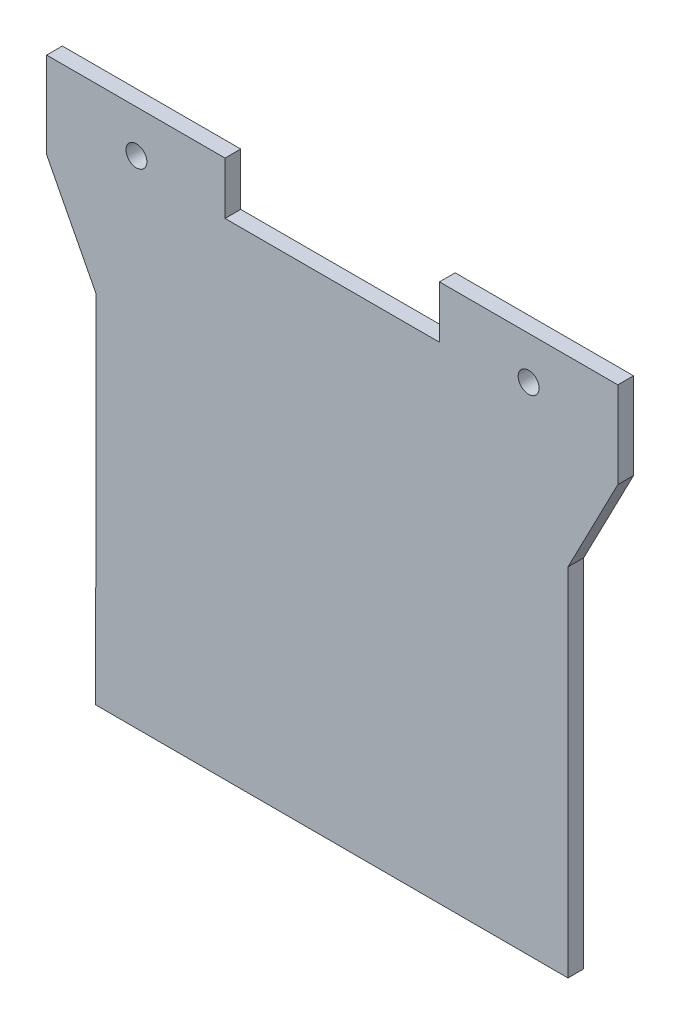
ISO-10303-21;
HEADER;
FILE_DESCRIPTION(('STEP AP214'),'2;1');
FILE_NAME('part.step','',(''),(''),'','','');
FILE_SCHEMA(('AUTOMOTIVE_DESIGN { 1 0 10303 214 1 1 1 1 }'));
ENDSEC;
DATA;
#1=APPLICATION_CONTEXT('core data for automotive mechanical design processes');
#2=APPLICATION_PROTOCOL_DEFINITION('international standard','automotive_design',2000,#1);
#3=PRODUCT_CONTEXT('',#1,'mechanical');
#4=PRODUCT('Part','Part','',(#3));
#5=PRODUCT_RELATED_PRODUCT_CATEGORY('part','',(#4));
#6=PRODUCT_DEFINITION_FORMATION('','',#4);
#7=PRODUCT_DEFINITION_CONTEXT('part definition',#1,'design');
#8=PRODUCT_DEFINITION('design','',#6,#7);
#9=PRODUCT_DEFINITION_SHAPE('','',#8);
#10=(LENGTH_UNIT() NAMED_UNIT(*) SI_UNIT(.MILLI.,.METRE.));
#11=(NAMED_UNIT(*) PLANE_ANGLE_UNIT() SI_UNIT($,.RADIAN.));
#12=(NAMED_UNIT(*) SI_UNIT($,.STERADIAN.) SOLID_ANGLE_UNIT());
#13=UNCERTAINTY_MEASURE_WITH_UNIT(LENGTH_MEASURE(1.E-05),#10,'distance_accuracy_value','');
#14=(GEOMETRIC_REPRESENTATION_CONTEXT(3) GLOBAL_UNCERTAINTY_ASSIGNED_CONTEXT((#13)) GLOBAL_UNIT_ASSIGNED_CONTEXT((#10,
#11,#12)) REPRESENTATION_CONTEXT('',''));
#15=CARTESIAN_POINT('',(0.,0.,0.));
#16=DIRECTION('',(0.,0.,1.));
#17=DIRECTION('',(1.,0.,0.));
#18=AXIS2_PLACEMENT_3D('',#15,#16,#17);
#19=CARTESIAN_POINT('',(0.,0.,3.));
#20=DIRECTION('',(0.,0.,1.));
#21=DIRECTION('',(1.,0.,0.));
#22=AXIS2_PLACEMENT_3D('',#19,#20,#21);
#23=PLANE('',#22);
#24=CARTESIAN_POINT('',(0.,0.,3.));
#25=DIRECTION('',(0.,0.,1.));
#26=DIRECTION('',(1.,0.,0.));
#27=AXIS2_PLACEMENT_3D('',#24,#25,#26);
#28=CIRCLE('',#27,2.);
#29=CARTESIAN_POINT('',(2.,0.,3.));
#30=VERTEX_POINT('',#29);
#31=EDGE_CURVE('E166',#30,#30,#28,.T.);
#32=ORIENTED_EDGE('',*,*,#31,.F.);
#33=EDGE_LOOP('',(#32));
#34=FACE_BOUND('',#33,.T.);
#35=DIRECTION('',(0.460081544608264,0.887876665033424,0.));
#36=VECTOR('',#35,1.);
#37=CARTESIAN_POINT('',(92.0524081163952,-8.43619126412211,3.));
#38=LINE('',#37,#36);
#39=CARTESIAN_POINT('',(82.5303663530536,-26.8120613337274,3.));
#40=VERTEX_POINT('',#39);
#41=CARTESIAN_POINT('',(92.0524081163952,-8.43619126412211,3.));
#42=VERTEX_POINT('',#41);
#43=EDGE_CURVE('E185',#40,#42,#38,.T.);
#44=ORIENTED_EDGE('',*,*,#43,.T.);
#45=DIRECTION('',(0.,1.,0.));
#46=VECTOR('',#45,1.);
#47=CARTESIAN_POINT('',(92.0524081163952,8.10208816705338,3.));
#48=LINE('',#47,#46);
#49=CARTESIAN_POINT('',(92.0524081163952,8.10208816705338,3.));
#50=VERTEX_POINT('',#49);
#51=EDGE_CURVE('E113',#42,#50,#48,.T.);
#52=ORIENTED_EDGE('',*,*,#51,.T.);
#53=DIRECTION('',(-1.,0.,0.));
#54=VECTOR('',#53,1.);
#55=CARTESIAN_POINT('',(57.9475918836048,8.10208816705338,3.));
#56=LINE('',#55,#54);
#57=CARTESIAN_POINT('',(57.9475918836048,8.10208816705338,3.));
#58=VERTEX_POINT('',#57);
#59=EDGE_CURVE('E212',#50,#58,#56,.T.);
#60=ORIENTED_EDGE('',*,*,#59,.T.);
#61=DIRECTION('',(0.,-1.,0.));
#62=VECTOR('',#61,1.);
#63=CARTESIAN_POINT('',(57.9475918836048,-1.89791183294662,3.));
#64=LINE('',#63,#62);
#65=CARTESIAN_POINT('',(57.9475918836048,-1.89791183294662,3.));
#66=VERTEX_POINT('',#65);
#67=EDGE_CURVE('E231',#58,#66,#64,.T.);
#68=ORIENTED_EDGE('',*,*,#67,.T.);
#69=DIRECTION('',(-1.,0.,0.));
#70=VECTOR('',#69,1.);
#71=CARTESIAN_POINT('',(16.9429738260778,-1.89791183294662,3.));
#72=LINE('',#71,#70);
#73=CARTESIAN_POINT('',(16.9429738260778,-1.89791183294662,3.));
#74=VERTEX_POINT('',#73);
#75=EDGE_CURVE('E228',#66,#74,#72,.T.);
#76=ORIENTED_EDGE('',*,*,#75,.T.);
#77=DIRECTION('',(0.,1.,0.));
#78=VECTOR('',#77,1.);
#79=CARTESIAN_POINT('',(16.9429738260778,-1.89791183294662,3.));
#80=LINE('',#79,#78);
#81=CARTESIAN_POINT('',(16.9429738260778,8.10208816705338,3.));
#82=VERTEX_POINT('',#81);
#83=EDGE_CURVE('E230',#74,#82,#80,.T.);
#84=ORIENTED_EDGE('',*,*,#83,.T.);
#85=DIRECTION('',(-1.,0.,0.));
#86=VECTOR('',#85,1.);
#87=CARTESIAN_POINT('',(-17.1710785217665,8.10208816705338,3.));
#88=LINE('',#87,#86);
#89=CARTESIAN_POINT('',(-17.1710785217665,8.10208816705338,3.));
#90=VERTEX_POINT('',#89);
#91=EDGE_CURVE('E233',#82,#90,#88,.T.);
#92=ORIENTED_EDGE('',*,*,#91,.T.);
#93=DIRECTION('',(-0.00157683113051485,-0.99999875680102,0.));
#94=VECTOR('',#93,1.);
#95=CARTESIAN_POINT('',(-17.197021162703,-8.35028151452313,3.));
#96=LINE('',#95,#94);
#97=CARTESIAN_POINT('',(-17.197021162703,-8.35028151452313,3.));
#98=VERTEX_POINT('',#97);
#99=EDGE_CURVE('E239',#90,#98,#96,.T.);
#100=ORIENTED_EDGE('',*,*,#99,.T.);
#101=DIRECTION('',(0.458684589096778,-0.88859914906842,0.));
#102=VECTOR('',#101,1.);
#103=CARTESIAN_POINT('',(-17.197021162703,-8.35028151452313,3.));
#104=LINE('',#103,#102);
#105=CARTESIAN_POINT('',(-7.7038913800261,-26.7411044185448,3.));
#106=VERTEX_POINT('',#105);
#107=EDGE_CURVE('E144',#98,#106,#104,.T.);
#108=ORIENTED_EDGE('',*,*,#107,.T.);
#109=DIRECTION('',(-0.00157272577151431,-0.999998763266059,0.));
#110=VECTOR('',#109,1.);
#111=CARTESIAN_POINT('',(-7.81096902870989,-94.8251392812351,3.));
#112=LINE('',#111,#110);
#113=CARTESIAN_POINT('',(-7.81096902870989,-94.8251392812351,3.));
#114=VERTEX_POINT('',#113);
#115=EDGE_CURVE('E138',#106,#114,#112,.T.);
#116=ORIENTED_EDGE('',*,*,#115,.T.);
#117=DIRECTION('',(0.999999690816467,-0.000786363128887586,0.));
#118=VECTOR('',#117,1.);
#119=CARTESIAN_POINT('',(-7.81096902870989,-94.8251392812351,3.));
#120=LINE('',#119,#118);
#121=CARTESIAN_POINT('',(82.5303663530536,-94.8961803983585,3.));
#122=VERTEX_POINT('',#121);
#123=EDGE_CURVE('E142',#114,#122,#120,.T.);
#124=ORIENTED_EDGE('',*,*,#123,.T.);
#125=DIRECTION('',(0.,1.,0.));
#126=VECTOR('',#125,1.);
#127=CARTESIAN_POINT('',(82.5303663530536,-26.8120613337274,3.));
#128=LINE('',#127,#126);
#129=EDGE_CURVE('E58',#122,#40,#128,.T.);
#130=ORIENTED_EDGE('',*,*,#129,.T.);
#131=EDGE_LOOP('',(#44,#52,#60,#68,#76,#84,#92,#100,#108,#116,#124,#130));
#132=FACE_BOUND('',#131,.T.);
#133=CARTESIAN_POINT('',(75.,0.,3.));
#134=DIRECTION('',(0.,0.,1.));
#135=DIRECTION('',(1.,0.,0.));
#136=AXIS2_PLACEMENT_3D('',#133,#134,#135);
#137=CIRCLE('',#136,2.);
#138=CARTESIAN_POINT('',(77.,0.,3.));
#139=VERTEX_POINT('',#138);
#140=EDGE_CURVE('E281',#139,#139,#137,.T.);
#141=ORIENTED_EDGE('',*,*,#140,.F.);
#142=EDGE_LOOP('',(#141));
#143=FACE_BOUND('',#142,.T.);
#144=ADVANCED_FACE('F41',(#34,#132,#143),#23,.T.);
#145=CARTESIAN_POINT('',(0.,0.,0.));
#146=DIRECTION('',(0.,0.,1.));
#147=DIRECTION('',(1.,0.,0.));
#148=AXIS2_PLACEMENT_3D('',#145,#146,#147);
#149=PLANE('',#148);
#150=DIRECTION('',(0.460081544608264,0.887876665033424,0.));
#151=VECTOR('',#150,1.);
#152=CARTESIAN_POINT('',(92.0524081163952,-8.43619126412211,0.));
#153=LINE('',#152,#151);
#154=CARTESIAN_POINT('',(82.5303663530536,-26.8120613337274,0.));
#155=VERTEX_POINT('',#154);
#156=CARTESIAN_POINT('',(92.0524081163952,-8.43619126412211,0.));
#157=VERTEX_POINT('',#156);
#158=EDGE_CURVE('E162',#155,#157,#153,.T.);
#159=ORIENTED_EDGE('',*,*,#158,.F.);
#160=DIRECTION('',(0.,1.,0.));
#161=VECTOR('',#160,1.);
#162=CARTESIAN_POINT('',(82.5303663530536,-26.8120613337274,0.));
#163=LINE('',#162,#161);
#164=CARTESIAN_POINT('',(82.5303663530536,-94.8961803983585,0.));
#165=VERTEX_POINT('',#164);
#166=EDGE_CURVE('E105',#165,#155,#163,.T.);
#167=ORIENTED_EDGE('',*,*,#166,.F.);
#168=DIRECTION('',(0.999999690816467,-0.000786363128887586,0.));
#169=VECTOR('',#168,1.);
#170=CARTESIAN_POINT('',(-7.81096902870989,-94.8251392812351,0.));
#171=LINE('',#170,#169);
#172=CARTESIAN_POINT('',(-7.81096902870989,-94.8251392812351,0.));
#173=VERTEX_POINT('',#172);
#174=EDGE_CURVE('E99',#173,#165,#171,.T.);
#175=ORIENTED_EDGE('',*,*,#174,.F.);
#176=DIRECTION('',(-0.00157272577151431,-0.999998763266059,0.));
#177=VECTOR('',#176,1.);
#178=CARTESIAN_POINT('',(-7.81096902870989,-94.8251392812351,0.));
#179=LINE('',#178,#177);
#180=CARTESIAN_POINT('',(-7.7038913800261,-26.7411044185448,0.));
#181=VERTEX_POINT('',#180);
#182=EDGE_CURVE('E152',#181,#173,#179,.T.);
#183=ORIENTED_EDGE('',*,*,#182,.F.);
#184=DIRECTION('',(0.458684589096778,-0.88859914906842,0.));
#185=VECTOR('',#184,1.);
#186=CARTESIAN_POINT('',(-17.197021162703,-8.35028151452313,0.));
#187=LINE('',#186,#185);
#188=CARTESIAN_POINT('',(-17.197021162703,-8.35028151452313,0.));
#189=VERTEX_POINT('',#188);
#190=EDGE_CURVE('E180',#189,#181,#187,.T.);
#191=ORIENTED_EDGE('',*,*,#190,.F.);
#192=DIRECTION('',(-0.00157683113051485,-0.99999875680102,0.));
#193=VECTOR('',#192,1.);
#194=CARTESIAN_POINT('',(-17.197021162703,-8.35028151452313,0.));
#195=LINE('',#194,#193);
#196=CARTESIAN_POINT('',(-17.1710785217665,8.10208816705338,0.));
#197=VERTEX_POINT('',#196);
#198=EDGE_CURVE('E178',#197,#189,#195,.T.);
#199=ORIENTED_EDGE('',*,*,#198,.F.);
#200=DIRECTION('',(-1.,0.,0.));
#201=VECTOR('',#200,1.);
#202=CARTESIAN_POINT('',(-17.1710785217665,8.10208816705338,0.));
#203=LINE('',#202,#201);
#204=CARTESIAN_POINT('',(16.9429738260778,8.10208816705338,0.));
#205=VERTEX_POINT('',#204);
#206=EDGE_CURVE('E176',#205,#197,#203,.T.);
#207=ORIENTED_EDGE('',*,*,#206,.F.);
#208=DIRECTION('',(0.,1.,0.));
#209=VECTOR('',#208,1.);
#210=CARTESIAN_POINT('',(16.9429738260778,-1.89791183294662,0.));
#211=LINE('',#210,#209);
#212=CARTESIAN_POINT('',(16.9429738260778,-1.89791183294662,0.));
#213=VERTEX_POINT('',#212);
#214=EDGE_CURVE('E174',#213,#205,#211,.T.);
#215=ORIENTED_EDGE('',*,*,#214,.F.);
#216=DIRECTION('',(-1.,0.,0.));
#217=VECTOR('',#216,1.);
#218=CARTESIAN_POINT('',(16.9429738260778,-1.89791183294662,0.));
#219=LINE('',#218,#217);
#220=CARTESIAN_POINT('',(57.9475918836048,-1.89791183294662,0.));
#221=VERTEX_POINT('',#220);
#222=EDGE_CURVE('E172',#221,#213,#219,.T.);
#223=ORIENTED_EDGE('',*,*,#222,.F.);
#224=DIRECTION('',(0.,-1.,0.));
#225=VECTOR('',#224,1.);
#226=CARTESIAN_POINT('',(57.9475918836048,-1.89791183294662,0.));
#227=LINE('',#226,#225);
#228=CARTESIAN_POINT('',(57.9475918836048,8.10208816705338,0.));
#229=VERTEX_POINT('',#228);
#230=EDGE_CURVE('E170',#229,#221,#227,.T.);
#231=ORIENTED_EDGE('',*,*,#230,.F.);
#232=DIRECTION('',(-1.,0.,0.));
#233=VECTOR('',#232,1.);
#234=CARTESIAN_POINT('',(57.9475918836048,8.10208816705338,0.));
#235=LINE('',#234,#233);
#236=CARTESIAN_POINT('',(92.0524081163952,8.10208816705338,0.));
#237=VERTEX_POINT('',#236);
#238=EDGE_CURVE('E168',#237,#229,#235,.T.);
#239=ORIENTED_EDGE('',*,*,#238,.F.);
#240=DIRECTION('',(0.,1.,0.));
#241=VECTOR('',#240,1.);
#242=CARTESIAN_POINT('',(92.0524081163952,8.10208816705338,0.));
#243=LINE('',#242,#241);
#244=EDGE_CURVE('E165',#157,#237,#243,.T.);
#245=ORIENTED_EDGE('',*,*,#244,.F.);
#246=EDGE_LOOP('',(#159,#167,#175,#183,#191,#199,#207,#215,#223,#231,#239,#245));
#247=FACE_BOUND('',#246,.T.);
#248=CARTESIAN_POINT('',(0.,0.,0.));
#249=DIRECTION('',(0.,0.,1.));
#250=DIRECTION('',(1.,0.,0.));
#251=AXIS2_PLACEMENT_3D('',#248,#249,#250);
#252=CIRCLE('',#251,2.);
#253=CARTESIAN_POINT('',(2.,0.,0.));
#254=VERTEX_POINT('',#253);
#255=EDGE_CURVE('E287',#254,#254,#252,.T.);
#256=ORIENTED_EDGE('',*,*,#255,.T.);
#257=EDGE_LOOP('',(#256));
#258=FACE_BOUND('',#257,.T.);
#259=CARTESIAN_POINT('',(75.,0.,0.));
#260=DIRECTION('',(0.,0.,1.));
#261=DIRECTION('',(1.,0.,0.));
#262=AXIS2_PLACEMENT_3D('',#259,#260,#261);
#263=CIRCLE('',#262,2.);
#264=CARTESIAN_POINT('',(77.,0.,0.));
#265=VERTEX_POINT('',#264);
#266=EDGE_CURVE('E284',#265,#265,#263,.T.);
#267=ORIENTED_EDGE('',*,*,#266,.T.);
#268=EDGE_LOOP('',(#267));
#269=FACE_BOUND('',#268,.T.);
#270=ADVANCED_FACE('F216',(#247,#258,#269),#149,.F.);
#271=CARTESIAN_POINT('',(92.0524081163952,-8.43619126412211,3.));
#272=DIRECTION('',(-0.887876665033424,0.460081544608264,0.));
#273=DIRECTION('',(-0.460081544608264,-0.887876665033424,0.));
#274=AXIS2_PLACEMENT_3D('',#271,#272,#273);
#275=PLANE('',#274);
#276=ORIENTED_EDGE('',*,*,#158,.T.);
#277=DIRECTION('',(0.,0.,-1.));
#278=VECTOR('',#277,1.);
#279=CARTESIAN_POINT('',(92.0524081163952,-8.43619126412211,3.));
#280=LINE('',#279,#278);
#281=EDGE_CURVE('E11',#42,#157,#280,.T.);
#282=ORIENTED_EDGE('',*,*,#281,.F.);
#283=ORIENTED_EDGE('',*,*,#43,.F.);
#284=DIRECTION('',(0.,0.,-1.));
#285=VECTOR('',#284,1.);
#286=CARTESIAN_POINT('',(82.5303663530536,-26.8120613337274,3.));
#287=LINE('',#286,#285);
#288=EDGE_CURVE('E158',#40,#155,#287,.T.);
#289=ORIENTED_EDGE('',*,*,#288,.T.);
#290=EDGE_LOOP('',(#276,#282,#283,#289));
#291=FACE_BOUND('',#290,.T.);
#292=ADVANCED_FACE('F43',(#291),#275,.F.);
#293=CARTESIAN_POINT('',(92.0524081163952,8.10208816705338,3.));
#294=DIRECTION('',(-1.,0.,0.));
#295=DIRECTION('',(0.,0.,1.));
#296=AXIS2_PLACEMENT_3D('',#293,#294,#295);
#297=PLANE('',#296);
#298=ORIENTED_EDGE('',*,*,#244,.T.);
#299=DIRECTION('',(0.,0.,-1.));
#300=VECTOR('',#299,1.);
#301=CARTESIAN_POINT('',(92.0524081163952,8.10208816705338,3.));
#302=LINE('',#301,#300);
#303=EDGE_CURVE('E50',#50,#237,#302,.T.);
#304=ORIENTED_EDGE('',*,*,#303,.F.);
#305=ORIENTED_EDGE('',*,*,#51,.F.);
#306=ORIENTED_EDGE('',*,*,#281,.T.);
#307=EDGE_LOOP('',(#298,#304,#305,#306));
#308=FACE_BOUND('',#307,.T.);
#309=ADVANCED_FACE('F382',(#308),#297,.F.);
#310=CARTESIAN_POINT('',(57.9475918836048,8.10208816705338,3.));
#311=DIRECTION('',(0.,-1.,0.));
#312=DIRECTION('',(0.,0.,-1.));
#313=AXIS2_PLACEMENT_3D('',#310,#311,#312);
#314=PLANE('',#313);
#315=ORIENTED_EDGE('',*,*,#238,.T.);
#316=DIRECTION('',(0.,0.,-1.));
#317=VECTOR('',#316,1.);
#318=CARTESIAN_POINT('',(57.9475918836048,8.10208816705338,3.));
#319=LINE('',#318,#317);
#320=EDGE_CURVE('E204',#58,#229,#319,.T.);
#321=ORIENTED_EDGE('',*,*,#320,.F.);
#322=ORIENTED_EDGE('',*,*,#59,.F.);
#323=ORIENTED_EDGE('',*,*,#303,.T.);
#324=EDGE_LOOP('',(#315,#321,#322,#323));
#325=FACE_BOUND('',#324,.T.);
#326=ADVANCED_FACE('F210',(#325),#314,.F.);
#327=CARTESIAN_POINT('',(57.9475918836048,-1.89791183294662,3.));
#328=DIRECTION('',(1.,0.,0.));
#329=DIRECTION('',(0.,0.,-1.));
#330=AXIS2_PLACEMENT_3D('',#327,#328,#329);
#331=PLANE('',#330);
#332=ORIENTED_EDGE('',*,*,#230,.T.);
#333=DIRECTION('',(0.,0.,-1.));
#334=VECTOR('',#333,1.);
#335=CARTESIAN_POINT('',(57.9475918836048,-1.89791183294662,3.));
#336=LINE('',#335,#334);
#337=EDGE_CURVE('E201',#66,#221,#336,.T.);
#338=ORIENTED_EDGE('',*,*,#337,.F.);
#339=ORIENTED_EDGE('',*,*,#67,.F.);
#340=ORIENTED_EDGE('',*,*,#320,.T.);
#341=EDGE_LOOP('',(#332,#338,#339,#340));
#342=FACE_BOUND('',#341,.T.);
#343=ADVANCED_FACE('F222',(#342),#331,.F.);
#344=CARTESIAN_POINT('',(16.9429738260778,-1.89791183294662,3.));
#345=DIRECTION('',(0.,-1.,0.));
#346=DIRECTION('',(1.,0.,0.));
#347=AXIS2_PLACEMENT_3D('',#344,#345,#346);
#348=PLANE('',#347);
#349=ORIENTED_EDGE('',*,*,#222,.T.);
#350=DIRECTION('',(0.,0.,-1.));
#351=VECTOR('',#350,1.);
#352=CARTESIAN_POINT('',(16.9429738260778,-1.89791183294662,3.));
#353=LINE('',#352,#351);
#354=EDGE_CURVE('E198',#74,#213,#353,.T.);
#355=ORIENTED_EDGE('',*,*,#354,.F.);
#356=ORIENTED_EDGE('',*,*,#75,.F.);
#357=ORIENTED_EDGE('',*,*,#337,.T.);
#358=EDGE_LOOP('',(#349,#355,#356,#357));
#359=FACE_BOUND('',#358,.T.);
#360=ADVANCED_FACE('F226',(#359),#348,.F.);
#361=CARTESIAN_POINT('',(16.9429738260778,-1.89791183294662,3.));
#362=DIRECTION('',(-1.,0.,0.));
#363=DIRECTION('',(0.,0.,1.));
#364=AXIS2_PLACEMENT_3D('',#361,#362,#363);
#365=PLANE('',#364);
#366=ORIENTED_EDGE('',*,*,#214,.T.);
#367=DIRECTION('',(0.,0.,-1.));
#368=VECTOR('',#367,1.);
#369=CARTESIAN_POINT('',(16.9429738260778,8.10208816705338,3.));
#370=LINE('',#369,#368);
#371=EDGE_CURVE('E195',#82,#205,#370,.T.);
#372=ORIENTED_EDGE('',*,*,#371,.F.);
#373=ORIENTED_EDGE('',*,*,#83,.F.);
#374=ORIENTED_EDGE('',*,*,#354,.T.);
#375=EDGE_LOOP('',(#366,#372,#373,#374));
#376=FACE_BOUND('',#375,.T.);
#377=ADVANCED_FACE('F347',(#376),#365,.F.);
#378=CARTESIAN_POINT('',(-17.1710785217665,8.10208816705338,3.));
#379=DIRECTION('',(0.,-1.,0.));
#380=DIRECTION('',(0.,0.,-1.));
#381=AXIS2_PLACEMENT_3D('',#378,#379,#380);
#382=PLANE('',#381);
#383=ORIENTED_EDGE('',*,*,#206,.T.);
#384=DIRECTION('',(0.,0.,-1.));
#385=VECTOR('',#384,1.);
#386=CARTESIAN_POINT('',(-17.1710785217665,8.10208816705338,3.));
#387=LINE('',#386,#385);
#388=EDGE_CURVE('E192',#90,#197,#387,.T.);
#389=ORIENTED_EDGE('',*,*,#388,.F.);
#390=ORIENTED_EDGE('',*,*,#91,.F.);
#391=ORIENTED_EDGE('',*,*,#371,.T.);
#392=EDGE_LOOP('',(#383,#389,#390,#391));
#393=FACE_BOUND('',#392,.T.);
#394=ADVANCED_FACE('F338',(#393),#382,.F.);
#395=CARTESIAN_POINT('',(-17.197021162703,-8.35028151452313,3.));
#396=DIRECTION('',(0.99999875680102,-0.00157683113051485,0.));
#397=DIRECTION('',(0.00157683113051485,0.99999875680102,0.));
#398=AXIS2_PLACEMENT_3D('',#395,#396,#397);
#399=PLANE('',#398);
#400=ORIENTED_EDGE('',*,*,#198,.T.);
#401=DIRECTION('',(0.,0.,-1.));
#402=VECTOR('',#401,1.);
#403=CARTESIAN_POINT('',(-17.197021162703,-8.35028151452313,3.));
#404=LINE('',#403,#402);
#405=EDGE_CURVE('E189',#98,#189,#404,.T.);
#406=ORIENTED_EDGE('',*,*,#405,.F.);
#407=ORIENTED_EDGE('',*,*,#99,.F.);
#408=ORIENTED_EDGE('',*,*,#388,.T.);
#409=EDGE_LOOP('',(#400,#406,#407,#408));
#410=FACE_BOUND('',#409,.T.);
#411=ADVANCED_FACE('F245',(#410),#399,.F.);
#412=CARTESIAN_POINT('',(-17.197021162703,-8.35028151452313,3.));
#413=DIRECTION('',(0.88859914906842,0.458684589096778,0.));
#414=DIRECTION('',(-0.458684589096778,0.88859914906842,0.));
#415=AXIS2_PLACEMENT_3D('',#412,#413,#414);
#416=PLANE('',#415);
#417=ORIENTED_EDGE('',*,*,#190,.T.);
#418=DIRECTION('',(0.,0.,-1.));
#419=VECTOR('',#418,1.);
#420=CARTESIAN_POINT('',(-7.7038913800261,-26.7411044185448,3.));
#421=LINE('',#420,#419);
#422=EDGE_CURVE('E153',#106,#181,#421,.T.);
#423=ORIENTED_EDGE('',*,*,#422,.F.);
#424=ORIENTED_EDGE('',*,*,#107,.F.);
#425=ORIENTED_EDGE('',*,*,#405,.T.);
#426=EDGE_LOOP('',(#417,#423,#424,#425));
#427=FACE_BOUND('',#426,.T.);
#428=ADVANCED_FACE('F249',(#427),#416,.F.);
#429=CARTESIAN_POINT('',(-7.81096902870989,-94.8251392812351,3.));
#430=DIRECTION('',(0.999998763266059,-0.00157272577151431,0.));
#431=DIRECTION('',(0.00157272577151431,0.999998763266059,0.));
#432=AXIS2_PLACEMENT_3D('',#429,#430,#431);
#433=PLANE('',#432);
#434=ORIENTED_EDGE('',*,*,#182,.T.);
#435=DIRECTION('',(0.,0.,-1.));
#436=VECTOR('',#435,1.);
#437=CARTESIAN_POINT('',(-7.81096902870989,-94.8251392812351,3.));
#438=LINE('',#437,#436);
#439=EDGE_CURVE('E149',#114,#173,#438,.T.);
#440=ORIENTED_EDGE('',*,*,#439,.F.);
#441=ORIENTED_EDGE('',*,*,#115,.F.);
#442=ORIENTED_EDGE('',*,*,#422,.T.);
#443=EDGE_LOOP('',(#434,#440,#441,#442));
#444=FACE_BOUND('',#443,.T.);
#445=ADVANCED_FACE('F150',(#444),#433,.F.);
#446=CARTESIAN_POINT('',(-7.81096902870989,-94.8251392812351,3.));
#447=DIRECTION('',(0.000786363128887586,0.999999690816467,0.));
#448=DIRECTION('',(-0.999999690816467,0.000786363128887586,0.));
#449=AXIS2_PLACEMENT_3D('',#446,#447,#448);
#450=PLANE('',#449);
#451=ORIENTED_EDGE('',*,*,#174,.T.);
#452=DIRECTION('',(0.,0.,-1.));
#453=VECTOR('',#452,1.);
#454=CARTESIAN_POINT('',(82.5303663530536,-94.8961803983585,3.));
#455=LINE('',#454,#453);
#456=EDGE_CURVE('E154',#122,#165,#455,.T.);
#457=ORIENTED_EDGE('',*,*,#456,.F.);
#458=ORIENTED_EDGE('',*,*,#123,.F.);
#459=ORIENTED_EDGE('',*,*,#439,.T.);
#460=EDGE_LOOP('',(#451,#457,#458,#459));
#461=FACE_BOUND('',#460,.T.);
#462=ADVANCED_FACE('F156',(#461),#450,.F.);
#463=CARTESIAN_POINT('',(82.5303663530536,-26.8120613337274,3.));
#464=DIRECTION('',(-1.,0.,0.));
#465=DIRECTION('',(0.,-1.,0.));
#466=AXIS2_PLACEMENT_3D('',#463,#464,#465);
#467=PLANE('',#466);
#468=ORIENTED_EDGE('',*,*,#166,.T.);
#469=ORIENTED_EDGE('',*,*,#288,.F.);
#470=ORIENTED_EDGE('',*,*,#129,.F.);
#471=ORIENTED_EDGE('',*,*,#456,.T.);
#472=EDGE_LOOP('',(#468,#469,#470,#471));
#473=FACE_BOUND('',#472,.T.);
#474=ADVANCED_FACE('F253',(#473),#467,.F.);
#475=CARTESIAN_POINT('',(0.,0.,3.));
#476=DIRECTION('',(0.,0.,-1.));
#477=DIRECTION('',(-1.,0.,0.));
#478=AXIS2_PLACEMENT_3D('',#475,#476,#477);
#479=CYLINDRICAL_SURFACE('',#478,2.);
#480=ORIENTED_EDGE('',*,*,#31,.T.);
#481=EDGE_LOOP('',(#480));
#482=FACE_BOUND('',#481,.T.);
#483=ORIENTED_EDGE('',*,*,#255,.F.);
#484=EDGE_LOOP('',(#483));
#485=FACE_BOUND('',#484,.T.);
#486=ADVANCED_FACE('F255',(#482,#485),#479,.F.);
#487=CARTESIAN_POINT('',(75.,0.,3.));
#488=DIRECTION('',(0.,0.,-1.));
#489=DIRECTION('',(-1.,0.,0.));
#490=AXIS2_PLACEMENT_3D('',#487,#488,#489);
#491=CYLINDRICAL_SURFACE('',#490,2.);
#492=ORIENTED_EDGE('',*,*,#140,.T.);
#493=EDGE_LOOP('',(#492));
#494=FACE_BOUND('',#493,.T.);
#495=ORIENTED_EDGE('',*,*,#266,.F.);
#496=EDGE_LOOP('',(#495));
#497=FACE_BOUND('',#496,.T.);
#498=ADVANCED_FACE('F261',(#494,#497),#491,.F.);
#499=CLOSED_SHELL('',(#144,#270,#292,#309,#326,#343,#360,#377,#394,#411,#428,#445,#462,#474,
#486,#498));
#500=MANIFOLD_SOLID_BREP('B2',#499);
#501=ADVANCED_BREP_SHAPE_REPRESENTATION('',(#18,#500),#14);
#502=SHAPE_DEFINITION_REPRESENTATION(#9,#501);
ENDSEC;
END-ISO-10303-21;
